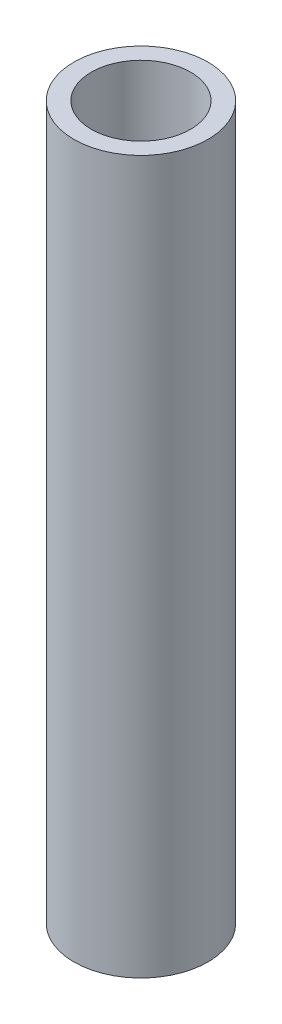
ISO-10303-21;
HEADER;
FILE_DESCRIPTION(('STEP AP214'),'2;1');
FILE_NAME('part.step','',(''),(''),'','','');
FILE_SCHEMA(('AUTOMOTIVE_DESIGN { 1 0 10303 214 1 1 1 1 }'));
ENDSEC;
DATA;
#1=APPLICATION_CONTEXT('core data for automotive mechanical design processes');
#2=APPLICATION_PROTOCOL_DEFINITION('international standard','automotive_design',2000,#1);
#3=PRODUCT_CONTEXT('',#1,'mechanical');
#4=PRODUCT('Part','Part','',(#3));
#5=PRODUCT_RELATED_PRODUCT_CATEGORY('part','',(#4));
#6=PRODUCT_DEFINITION_FORMATION('','',#4);
#7=PRODUCT_DEFINITION_CONTEXT('part definition',#1,'design');
#8=PRODUCT_DEFINITION('design','',#6,#7);
#9=PRODUCT_DEFINITION_SHAPE('','',#8);
#10=(LENGTH_UNIT() NAMED_UNIT(*) SI_UNIT(.MILLI.,.METRE.));
#11=(NAMED_UNIT(*) PLANE_ANGLE_UNIT() SI_UNIT($,.RADIAN.));
#12=(NAMED_UNIT(*) SI_UNIT($,.STERADIAN.) SOLID_ANGLE_UNIT());
#13=UNCERTAINTY_MEASURE_WITH_UNIT(LENGTH_MEASURE(1.E-05),#10,'distance_accuracy_value','');
#14=(GEOMETRIC_REPRESENTATION_CONTEXT(3) GLOBAL_UNCERTAINTY_ASSIGNED_CONTEXT((#13)) GLOBAL_UNIT_ASSIGNED_CONTEXT((#10,
#11,#12)) REPRESENTATION_CONTEXT('',''));
#15=CARTESIAN_POINT('',(0.,0.,0.));
#16=DIRECTION('',(0.,0.,1.));
#17=DIRECTION('',(1.,0.,0.));
#18=AXIS2_PLACEMENT_3D('',#15,#16,#17);
#19=CARTESIAN_POINT('',(0.,135.,-1.11022302462516E-13));
#20=DIRECTION('',(0.,1.,0.));
#21=DIRECTION('',(0.,0.,1.));
#22=AXIS2_PLACEMENT_3D('',#19,#20,#21);
#23=PLANE('',#22);
#24=CARTESIAN_POINT('',(0.,135.,-1.11022302462516E-13));
#25=DIRECTION('',(0.,1.,0.));
#26=DIRECTION('',(0.,0.,1.));
#27=AXIS2_PLACEMENT_3D('',#24,#25,#26);
#28=CIRCLE('',#27,12.7);
#29=CARTESIAN_POINT('',(0.,135.,12.6999999999999));
#30=VERTEX_POINT('',#29);
#31=EDGE_CURVE('E10',#30,#30,#28,.T.);
#32=ORIENTED_EDGE('',*,*,#31,.T.);
#33=EDGE_LOOP('',(#32));
#34=FACE_BOUND('',#33,.T.);
#35=CARTESIAN_POINT('',(0.,135.,-1.11022302462516E-13));
#36=DIRECTION('',(0.,1.,0.));
#37=DIRECTION('',(0.,0.,1.));
#38=AXIS2_PLACEMENT_3D('',#35,#36,#37);
#39=CIRCLE('',#38,9.398);
#40=CARTESIAN_POINT('',(0.,135.,9.39799999999989));
#41=VERTEX_POINT('',#40);
#42=EDGE_CURVE('E55',#41,#41,#39,.T.);
#43=ORIENTED_EDGE('',*,*,#42,.F.);
#44=EDGE_LOOP('',(#43));
#45=FACE_BOUND('',#44,.T.);
#46=ADVANCED_FACE('F41',(#34,#45),#23,.T.);
#47=CARTESIAN_POINT('',(0.,0.,0.));
#48=DIRECTION('',(0.,1.,0.));
#49=DIRECTION('',(0.,0.,1.));
#50=AXIS2_PLACEMENT_3D('',#47,#48,#49);
#51=PLANE('',#50);
#52=CARTESIAN_POINT('',(0.,0.,0.));
#53=DIRECTION('',(0.,1.,0.));
#54=DIRECTION('',(0.,0.,1.));
#55=AXIS2_PLACEMENT_3D('',#52,#53,#54);
#56=CIRCLE('',#55,12.7);
#57=CARTESIAN_POINT('',(0.,0.,12.7));
#58=VERTEX_POINT('',#57);
#59=EDGE_CURVE('E45',#58,#58,#56,.T.);
#60=ORIENTED_EDGE('',*,*,#59,.F.);
#61=EDGE_LOOP('',(#60));
#62=FACE_BOUND('',#61,.T.);
#63=CARTESIAN_POINT('',(0.,0.,0.));
#64=DIRECTION('',(0.,1.,0.));
#65=DIRECTION('',(0.,0.,1.));
#66=AXIS2_PLACEMENT_3D('',#63,#64,#65);
#67=CIRCLE('',#66,9.398);
#68=CARTESIAN_POINT('',(0.,0.,9.398));
#69=VERTEX_POINT('',#68);
#70=EDGE_CURVE('E57',#69,#69,#67,.T.);
#71=ORIENTED_EDGE('',*,*,#70,.T.);
#72=EDGE_LOOP('',(#71));
#73=FACE_BOUND('',#72,.T.);
#74=ADVANCED_FACE('F70',(#62,#73),#51,.F.);
#75=CARTESIAN_POINT('',(0.,135.,-1.11022302462516E-13));
#76=DIRECTION('',(0.,-1.,0.));
#77=DIRECTION('',(0.,0.,-1.));
#78=AXIS2_PLACEMENT_3D('',#75,#76,#77);
#79=CYLINDRICAL_SURFACE('',#78,12.7);
#80=ORIENTED_EDGE('',*,*,#31,.F.);
#81=EDGE_LOOP('',(#80));
#82=FACE_BOUND('',#81,.T.);
#83=ORIENTED_EDGE('',*,*,#59,.T.);
#84=EDGE_LOOP('',(#83));
#85=FACE_BOUND('',#84,.T.);
#86=ADVANCED_FACE('F43',(#82,#85),#79,.T.);
#87=CARTESIAN_POINT('',(0.,135.,-1.11022302462516E-13));
#88=DIRECTION('',(0.,-1.,0.));
#89=DIRECTION('',(0.,0.,-1.));
#90=AXIS2_PLACEMENT_3D('',#87,#88,#89);
#91=CYLINDRICAL_SURFACE('',#90,9.398);
#92=ORIENTED_EDGE('',*,*,#42,.T.);
#93=EDGE_LOOP('',(#92));
#94=FACE_BOUND('',#93,.T.);
#95=ORIENTED_EDGE('',*,*,#70,.F.);
#96=EDGE_LOOP('',(#95));
#97=FACE_BOUND('',#96,.T.);
#98=ADVANCED_FACE('F66',(#94,#97),#91,.F.);
#99=CLOSED_SHELL('',(#46,#74,#86,#98));
#100=MANIFOLD_SOLID_BREP('B2',#99);
#101=ADVANCED_BREP_SHAPE_REPRESENTATION('',(#18,#100),#14);
#102=SHAPE_DEFINITION_REPRESENTATION(#9,#101);
ENDSEC;
END-ISO-10303-21;
